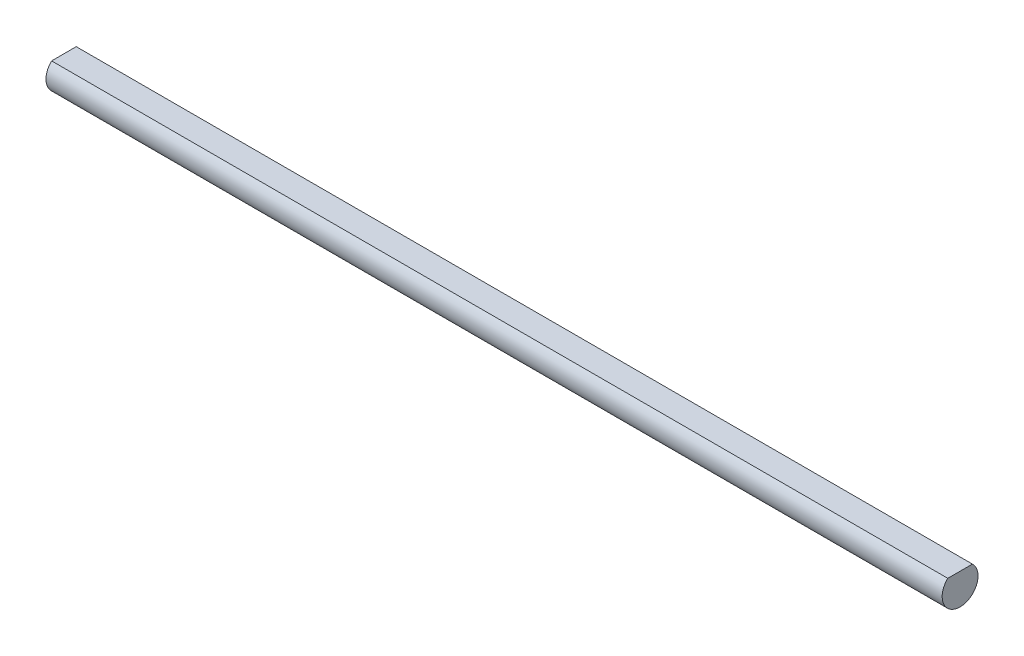
ISO-10303-21;
HEADER;
FILE_DESCRIPTION(('STEP AP214'),'2;1');
FILE_NAME('part.step','',(''),(''),'','','');
FILE_SCHEMA(('AUTOMOTIVE_DESIGN { 1 0 10303 214 1 1 1 1 }'));
ENDSEC;
DATA;
#1=APPLICATION_CONTEXT('core data for automotive mechanical design processes');
#2=APPLICATION_PROTOCOL_DEFINITION('international standard','automotive_design',2000,#1);
#3=PRODUCT_CONTEXT('',#1,'mechanical');
#4=PRODUCT('Part','Part','',(#3));
#5=PRODUCT_RELATED_PRODUCT_CATEGORY('part','',(#4));
#6=PRODUCT_DEFINITION_FORMATION('','',#4);
#7=PRODUCT_DEFINITION_CONTEXT('part definition',#1,'design');
#8=PRODUCT_DEFINITION('design','',#6,#7);
#9=PRODUCT_DEFINITION_SHAPE('','',#8);
#10=(LENGTH_UNIT() NAMED_UNIT(*) SI_UNIT(.MILLI.,.METRE.));
#11=(NAMED_UNIT(*) PLANE_ANGLE_UNIT() SI_UNIT($,.RADIAN.));
#12=(NAMED_UNIT(*) SI_UNIT($,.STERADIAN.) SOLID_ANGLE_UNIT());
#13=UNCERTAINTY_MEASURE_WITH_UNIT(LENGTH_MEASURE(1.E-05),#10,'distance_accuracy_value','');
#14=(GEOMETRIC_REPRESENTATION_CONTEXT(3) GLOBAL_UNCERTAINTY_ASSIGNED_CONTEXT((#13)) GLOBAL_UNIT_ASSIGNED_CONTEXT((#10,
#11,#12)) REPRESENTATION_CONTEXT('',''));
#15=CARTESIAN_POINT('',(0.,0.,0.));
#16=DIRECTION('',(0.,0.,1.));
#17=DIRECTION('',(1.,0.,0.));
#18=AXIS2_PLACEMENT_3D('',#15,#16,#17);
#19=CARTESIAN_POINT('',(100.,0.,0.));
#20=DIRECTION('',(-1.,0.,0.));
#21=DIRECTION('',(0.,0.,1.));
#22=AXIS2_PLACEMENT_3D('',#19,#20,#21);
#23=CYLINDRICAL_SURFACE('',#22,4.);
#24=CARTESIAN_POINT('',(-100.,0.,0.));
#25=DIRECTION('',(1.,0.,0.));
#26=DIRECTION('',(0.,0.,-1.));
#27=AXIS2_PLACEMENT_3D('',#24,#25,#26);
#28=CIRCLE('',#27,4.);
#29=CARTESIAN_POINT('',(-100.,2.90473750965556,2.75));
#30=VERTEX_POINT('',#29);
#31=CARTESIAN_POINT('',(-100.,2.90473750965556,-2.75));
#32=VERTEX_POINT('',#31);
#33=EDGE_CURVE('E72',#30,#32,#28,.T.);
#34=ORIENTED_EDGE('',*,*,#33,.T.);
#35=DIRECTION('',(-1.,0.,0.));
#36=VECTOR('',#35,1.);
#37=CARTESIAN_POINT('',(100.,2.90473750965556,-2.75));
#38=LINE('',#37,#36);
#39=CARTESIAN_POINT('',(100.,2.90473750965556,-2.75));
#40=VERTEX_POINT('',#39);
#41=EDGE_CURVE('E11',#40,#32,#38,.T.);
#42=ORIENTED_EDGE('',*,*,#41,.F.);
#43=CARTESIAN_POINT('',(100.,0.,0.));
#44=DIRECTION('',(1.,0.,0.));
#45=DIRECTION('',(0.,0.,-1.));
#46=AXIS2_PLACEMENT_3D('',#43,#44,#45);
#47=CIRCLE('',#46,4.);
#48=CARTESIAN_POINT('',(100.,2.90473750965556,2.75));
#49=VERTEX_POINT('',#48);
#50=EDGE_CURVE('E71',#49,#40,#47,.T.);
#51=ORIENTED_EDGE('',*,*,#50,.F.);
#52=DIRECTION('',(-1.,0.,0.));
#53=VECTOR('',#52,1.);
#54=CARTESIAN_POINT('',(100.,2.90473750965556,2.75));
#55=LINE('',#54,#53);
#56=EDGE_CURVE('E49',#49,#30,#55,.T.);
#57=ORIENTED_EDGE('',*,*,#56,.T.);
#58=EDGE_LOOP('',(#34,#42,#51,#57));
#59=FACE_BOUND('',#58,.T.);
#60=ADVANCED_FACE('F41',(#59),#23,.T.);
#61=CARTESIAN_POINT('',(100.,2.90473750965556,2.75));
#62=DIRECTION('',(0.,-1.,0.));
#63=DIRECTION('',(0.,0.,-1.));
#64=AXIS2_PLACEMENT_3D('',#61,#62,#63);
#65=PLANE('',#64);
#66=DIRECTION('',(0.,0.,1.));
#67=VECTOR('',#66,1.);
#68=CARTESIAN_POINT('',(-100.,2.90473750965556,2.75));
#69=LINE('',#68,#67);
#70=EDGE_CURVE('E64',#32,#30,#69,.T.);
#71=ORIENTED_EDGE('',*,*,#70,.T.);
#72=ORIENTED_EDGE('',*,*,#56,.F.);
#73=DIRECTION('',(0.,0.,1.));
#74=VECTOR('',#73,1.);
#75=CARTESIAN_POINT('',(100.,2.90473750965556,2.75));
#76=LINE('',#75,#74);
#77=EDGE_CURVE('E56',#40,#49,#76,.T.);
#78=ORIENTED_EDGE('',*,*,#77,.F.);
#79=ORIENTED_EDGE('',*,*,#41,.T.);
#80=EDGE_LOOP('',(#71,#72,#78,#79));
#81=FACE_BOUND('',#80,.T.);
#82=ADVANCED_FACE('F67',(#81),#65,.F.);
#83=CARTESIAN_POINT('',(100.,0.,0.));
#84=DIRECTION('',(1.,0.,0.));
#85=DIRECTION('',(0.,0.,-1.));
#86=AXIS2_PLACEMENT_3D('',#83,#84,#85);
#87=PLANE('',#86);
#88=ORIENTED_EDGE('',*,*,#50,.T.);
#89=ORIENTED_EDGE('',*,*,#77,.T.);
#90=EDGE_LOOP('',(#88,#89));
#91=FACE_BOUND('',#90,.T.);
#92=ADVANCED_FACE('F79',(#91),#87,.T.);
#93=CARTESIAN_POINT('',(-100.,0.,0.));
#94=DIRECTION('',(1.,0.,0.));
#95=DIRECTION('',(0.,0.,-1.));
#96=AXIS2_PLACEMENT_3D('',#93,#94,#95);
#97=PLANE('',#96);
#98=ORIENTED_EDGE('',*,*,#33,.F.);
#99=ORIENTED_EDGE('',*,*,#70,.F.);
#100=EDGE_LOOP('',(#98,#99));
#101=FACE_BOUND('',#100,.T.);
#102=ADVANCED_FACE('F75',(#101),#97,.F.);
#103=CLOSED_SHELL('',(#60,#82,#92,#102));
#104=MANIFOLD_SOLID_BREP('B2',#103);
#105=ADVANCED_BREP_SHAPE_REPRESENTATION('',(#18,#104),#14);
#106=SHAPE_DEFINITION_REPRESENTATION(#9,#105);
ENDSEC;
END-ISO-10303-21;
